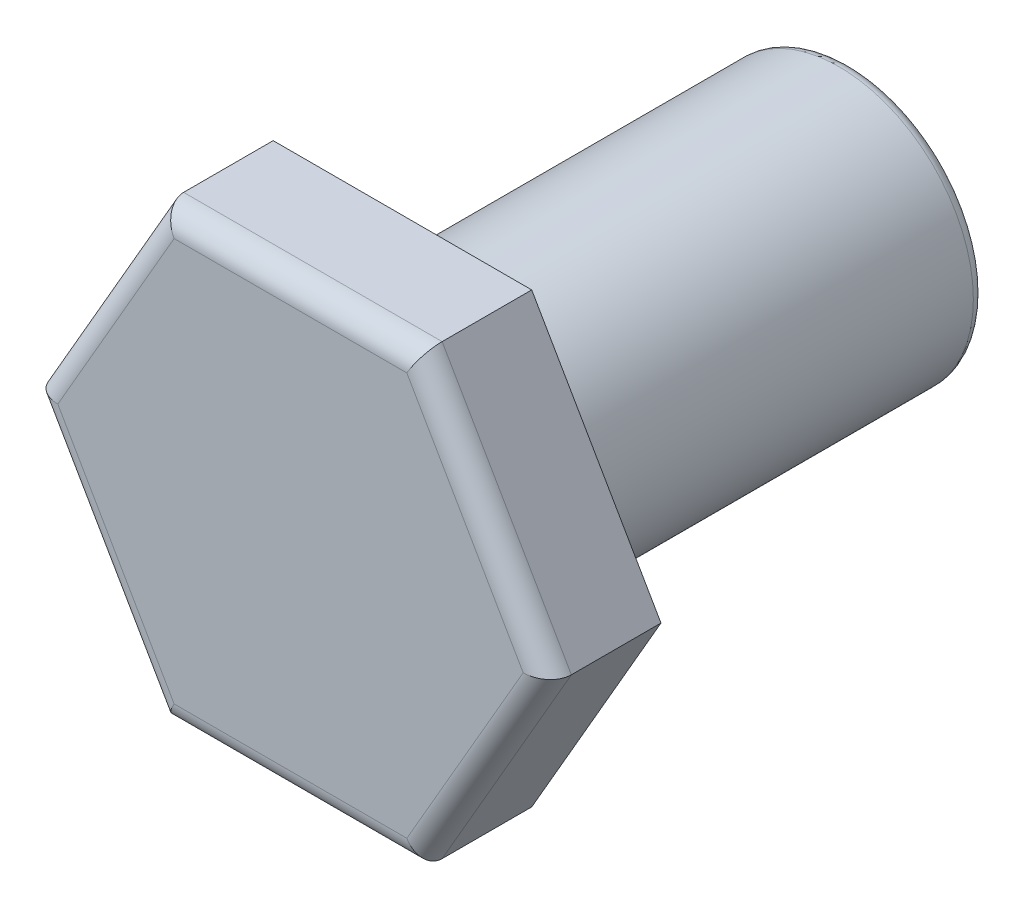
ISO-10303-21;
HEADER;
FILE_DESCRIPTION(('STEP AP214'),'2;1');
FILE_NAME('part.step','',(''),(''),'','','');
FILE_SCHEMA(('AUTOMOTIVE_DESIGN { 1 0 10303 214 1 1 1 1 }'));
ENDSEC;
DATA;
#1=APPLICATION_CONTEXT('core data for automotive mechanical design processes');
#2=APPLICATION_PROTOCOL_DEFINITION('international standard','automotive_design',2000,#1);
#3=PRODUCT_CONTEXT('',#1,'mechanical');
#4=PRODUCT('Part','Part','',(#3));
#5=PRODUCT_RELATED_PRODUCT_CATEGORY('part','',(#4));
#6=PRODUCT_DEFINITION_FORMATION('','',#4);
#7=PRODUCT_DEFINITION_CONTEXT('part definition',#1,'design');
#8=PRODUCT_DEFINITION('design','',#6,#7);
#9=PRODUCT_DEFINITION_SHAPE('','',#8);
#10=(LENGTH_UNIT() NAMED_UNIT(*) SI_UNIT(.MILLI.,.METRE.));
#11=(NAMED_UNIT(*) PLANE_ANGLE_UNIT() SI_UNIT($,.RADIAN.));
#12=(NAMED_UNIT(*) SI_UNIT($,.STERADIAN.) SOLID_ANGLE_UNIT());
#13=UNCERTAINTY_MEASURE_WITH_UNIT(LENGTH_MEASURE(1.E-05),#10,'distance_accuracy_value','');
#14=(GEOMETRIC_REPRESENTATION_CONTEXT(3) GLOBAL_UNCERTAINTY_ASSIGNED_CONTEXT((#13)) GLOBAL_UNIT_ASSIGNED_CONTEXT((#10,
#11,#12)) REPRESENTATION_CONTEXT('',''));
#15=CARTESIAN_POINT('',(0.,0.,0.));
#16=DIRECTION('',(0.,0.,1.));
#17=DIRECTION('',(1.,0.,0.));
#18=AXIS2_PLACEMENT_3D('',#15,#16,#17);
#19=CARTESIAN_POINT('',(0.,0.,25.));
#20=DIRECTION('',(0.,0.,-1.));
#21=DIRECTION('',(-1.,0.,0.));
#22=AXIS2_PLACEMENT_3D('',#19,#20,#21);
#23=CYLINDRICAL_SURFACE('',#22,6.);
#24=CARTESIAN_POINT('',(0.,0.,0.5));
#25=DIRECTION('',(0.,0.,1.));
#26=DIRECTION('',(1.,0.,0.));
#27=AXIS2_PLACEMENT_3D('',#24,#25,#26);
#28=CIRCLE('',#27,6.);
#29=CARTESIAN_POINT('',(6.,0.,0.5));
#30=VERTEX_POINT('',#29);
#31=EDGE_CURVE('E42',#30,#30,#28,.T.);
#32=ORIENTED_EDGE('',*,*,#31,.T.);
#33=EDGE_LOOP('',(#32));
#34=FACE_BOUND('',#33,.T.);
#35=CARTESIAN_POINT('',(0.,0.,20.));
#36=DIRECTION('',(0.,0.,1.));
#37=DIRECTION('',(1.,0.,0.));
#38=AXIS2_PLACEMENT_3D('',#35,#36,#37);
#39=CIRCLE('',#38,6.);
#40=CARTESIAN_POINT('',(6.,0.,20.));
#41=VERTEX_POINT('',#40);
#42=EDGE_CURVE('E149',#41,#41,#39,.T.);
#43=ORIENTED_EDGE('',*,*,#42,.F.);
#44=EDGE_LOOP('',(#43));
#45=FACE_BOUND('',#44,.T.);
#46=ADVANCED_FACE('F34',(#34,#45),#23,.T.);
#47=CARTESIAN_POINT('',(0.,0.,0.));
#48=DIRECTION('',(0.,0.,1.));
#49=DIRECTION('',(1.,0.,0.));
#50=AXIS2_PLACEMENT_3D('',#47,#48,#49);
#51=PLANE('',#50);
#52=CARTESIAN_POINT('',(0.,0.,0.));
#53=DIRECTION('',(0.,0.,1.));
#54=DIRECTION('',(1.,0.,0.));
#55=AXIS2_PLACEMENT_3D('',#52,#53,#54);
#56=CIRCLE('',#55,5.5);
#57=CARTESIAN_POINT('',(5.5,0.,0.));
#58=VERTEX_POINT('',#57);
#59=EDGE_CURVE('E11',#58,#58,#56,.F.);
#60=ORIENTED_EDGE('',*,*,#59,.T.);
#61=EDGE_LOOP('',(#60));
#62=FACE_BOUND('',#61,.T.);
#63=ADVANCED_FACE('F208',(#62),#51,.F.);
#64=CARTESIAN_POINT('',(0.,0.,20.));
#65=DIRECTION('',(0.,0.,1.));
#66=DIRECTION('',(1.,0.,0.));
#67=AXIS2_PLACEMENT_3D('',#64,#65,#66);
#68=PLANE('',#67);
#69=DIRECTION('',(1.,0.,0.));
#70=VECTOR('',#69,1.);
#71=CARTESIAN_POINT('',(-5.77350269189626,-10.,20.));
#72=LINE('',#71,#70);
#73=CARTESIAN_POINT('',(-5.77350269189626,-10.,20.));
#74=VERTEX_POINT('',#73);
#75=CARTESIAN_POINT('',(5.77350269189626,-10.,20.));
#76=VERTEX_POINT('',#75);
#77=EDGE_CURVE('E125',#74,#76,#72,.T.);
#78=ORIENTED_EDGE('',*,*,#77,.F.);
#79=DIRECTION('',(0.5,-0.866025403784439,0.));
#80=VECTOR('',#79,1.);
#81=CARTESIAN_POINT('',(-11.5470053837925,0.,20.));
#82=LINE('',#81,#80);
#83=CARTESIAN_POINT('',(-11.5470053837925,0.,20.));
#84=VERTEX_POINT('',#83);
#85=EDGE_CURVE('E117',#84,#74,#82,.T.);
#86=ORIENTED_EDGE('',*,*,#85,.F.);
#87=DIRECTION('',(-0.5,-0.866025403784439,0.));
#88=VECTOR('',#87,1.);
#89=CARTESIAN_POINT('',(-5.77350269189626,10.,20.));
#90=LINE('',#89,#88);
#91=CARTESIAN_POINT('',(-5.77350269189626,10.,20.));
#92=VERTEX_POINT('',#91);
#93=EDGE_CURVE('E144',#92,#84,#90,.T.);
#94=ORIENTED_EDGE('',*,*,#93,.F.);
#95=DIRECTION('',(-1.,0.,0.));
#96=VECTOR('',#95,1.);
#97=CARTESIAN_POINT('',(5.77350269189626,10.,20.));
#98=LINE('',#97,#96);
#99=CARTESIAN_POINT('',(5.77350269189626,10.,20.));
#100=VERTEX_POINT('',#99);
#101=EDGE_CURVE('E141',#100,#92,#98,.T.);
#102=ORIENTED_EDGE('',*,*,#101,.F.);
#103=DIRECTION('',(-0.5,0.866025403784439,0.));
#104=VECTOR('',#103,1.);
#105=CARTESIAN_POINT('',(11.5470053837925,0.,20.));
#106=LINE('',#105,#104);
#107=CARTESIAN_POINT('',(11.5470053837925,0.,20.));
#108=VERTEX_POINT('',#107);
#109=EDGE_CURVE('E129',#108,#100,#106,.T.);
#110=ORIENTED_EDGE('',*,*,#109,.F.);
#111=DIRECTION('',(0.5,0.866025403784439,0.));
#112=VECTOR('',#111,1.);
#113=CARTESIAN_POINT('',(5.77350269189626,-10.,20.));
#114=LINE('',#113,#112);
#115=EDGE_CURVE('E111',#76,#108,#114,.T.);
#116=ORIENTED_EDGE('',*,*,#115,.F.);
#117=EDGE_LOOP('',(#78,#86,#94,#102,#110,#116));
#118=FACE_BOUND('',#117,.T.);
#119=ORIENTED_EDGE('',*,*,#42,.T.);
#120=EDGE_LOOP('',(#119));
#121=FACE_BOUND('',#120,.T.);
#122=ADVANCED_FACE('F122',(#118,#121),#68,.F.);
#123=CARTESIAN_POINT('',(-5.77350269189626,-10.,20.));
#124=DIRECTION('',(0.,-1.,0.));
#125=DIRECTION('',(1.,0.,0.));
#126=AXIS2_PLACEMENT_3D('',#123,#124,#125);
#127=PLANE('',#126);
#128=DIRECTION('',(0.,0.,1.));
#129=VECTOR('',#128,1.);
#130=CARTESIAN_POINT('',(5.77350269189626,-10.,20.));
#131=LINE('',#130,#129);
#132=CARTESIAN_POINT('',(5.77350269189626,-10.,24.));
#133=VERTEX_POINT('',#132);
#134=EDGE_CURVE('E107',#76,#133,#131,.T.);
#135=ORIENTED_EDGE('',*,*,#134,.T.);
#136=DIRECTION('',(1.,0.,0.));
#137=VECTOR('',#136,1.);
#138=CARTESIAN_POINT('',(-5.77350269189626,-10.,24.));
#139=LINE('',#138,#137);
#140=CARTESIAN_POINT('',(-5.77350269189626,-10.,24.));
#141=VERTEX_POINT('',#140);
#142=EDGE_CURVE('E173',#133,#141,#139,.F.);
#143=ORIENTED_EDGE('',*,*,#142,.T.);
#144=DIRECTION('',(0.,0.,1.));
#145=VECTOR('',#144,1.);
#146=CARTESIAN_POINT('',(-5.77350269189626,-10.,20.));
#147=LINE('',#146,#145);
#148=EDGE_CURVE('E133',#74,#141,#147,.T.);
#149=ORIENTED_EDGE('',*,*,#148,.F.);
#150=ORIENTED_EDGE('',*,*,#77,.T.);
#151=EDGE_LOOP('',(#135,#143,#149,#150));
#152=FACE_BOUND('',#151,.T.);
#153=ADVANCED_FACE('F131',(#152),#127,.T.);
#154=CARTESIAN_POINT('',(-11.5470053837925,0.,20.));
#155=DIRECTION('',(-0.866025403784439,-0.5,0.));
#156=DIRECTION('',(0.5,-0.866025403784439,0.));
#157=AXIS2_PLACEMENT_3D('',#154,#155,#156);
#158=PLANE('',#157);
#159=ORIENTED_EDGE('',*,*,#148,.T.);
#160=DIRECTION('',(0.5,-0.866025403784439,0.));
#161=VECTOR('',#160,1.);
#162=CARTESIAN_POINT('',(-11.5470053837925,0.,24.));
#163=LINE('',#162,#161);
#164=CARTESIAN_POINT('',(-11.5470053837925,0.,24.));
#165=VERTEX_POINT('',#164);
#166=EDGE_CURVE('E175',#141,#165,#163,.F.);
#167=ORIENTED_EDGE('',*,*,#166,.T.);
#168=DIRECTION('',(0.,0.,1.));
#169=VECTOR('',#168,1.);
#170=CARTESIAN_POINT('',(-11.5470053837925,0.,20.));
#171=LINE('',#170,#169);
#172=EDGE_CURVE('E150',#84,#165,#171,.T.);
#173=ORIENTED_EDGE('',*,*,#172,.F.);
#174=ORIENTED_EDGE('',*,*,#85,.T.);
#175=EDGE_LOOP('',(#159,#167,#173,#174));
#176=FACE_BOUND('',#175,.T.);
#177=ADVANCED_FACE('F256',(#176),#158,.T.);
#178=CARTESIAN_POINT('',(-5.77350269189626,10.,20.));
#179=DIRECTION('',(-0.866025403784439,0.5,0.));
#180=DIRECTION('',(-0.5,-0.866025403784439,0.));
#181=AXIS2_PLACEMENT_3D('',#178,#179,#180);
#182=PLANE('',#181);
#183=ORIENTED_EDGE('',*,*,#172,.T.);
#184=DIRECTION('',(-0.5,-0.866025403784439,0.));
#185=VECTOR('',#184,1.);
#186=CARTESIAN_POINT('',(-5.77350269189626,10.,24.));
#187=LINE('',#186,#185);
#188=CARTESIAN_POINT('',(-5.77350269189626,10.,24.));
#189=VERTEX_POINT('',#188);
#190=EDGE_CURVE('E57',#165,#189,#187,.F.);
#191=ORIENTED_EDGE('',*,*,#190,.T.);
#192=DIRECTION('',(0.,0.,1.));
#193=VECTOR('',#192,1.);
#194=CARTESIAN_POINT('',(-5.77350269189626,10.,20.));
#195=LINE('',#194,#193);
#196=EDGE_CURVE('E152',#92,#189,#195,.T.);
#197=ORIENTED_EDGE('',*,*,#196,.F.);
#198=ORIENTED_EDGE('',*,*,#93,.T.);
#199=EDGE_LOOP('',(#183,#191,#197,#198));
#200=FACE_BOUND('',#199,.T.);
#201=ADVANCED_FACE('F260',(#200),#182,.T.);
#202=CARTESIAN_POINT('',(5.77350269189626,10.,20.));
#203=DIRECTION('',(0.,1.,0.));
#204=DIRECTION('',(-1.,0.,0.));
#205=AXIS2_PLACEMENT_3D('',#202,#203,#204);
#206=PLANE('',#205);
#207=ORIENTED_EDGE('',*,*,#196,.T.);
#208=DIRECTION('',(-1.,0.,0.));
#209=VECTOR('',#208,1.);
#210=CARTESIAN_POINT('',(5.77350269189626,10.,24.));
#211=LINE('',#210,#209);
#212=CARTESIAN_POINT('',(5.77350269189626,10.,24.));
#213=VERTEX_POINT('',#212);
#214=EDGE_CURVE('E49',#189,#213,#211,.F.);
#215=ORIENTED_EDGE('',*,*,#214,.T.);
#216=DIRECTION('',(0.,0.,1.));
#217=VECTOR('',#216,1.);
#218=CARTESIAN_POINT('',(5.77350269189626,10.,20.));
#219=LINE('',#218,#217);
#220=EDGE_CURVE('E154',#100,#213,#219,.T.);
#221=ORIENTED_EDGE('',*,*,#220,.F.);
#222=ORIENTED_EDGE('',*,*,#101,.T.);
#223=EDGE_LOOP('',(#207,#215,#221,#222));
#224=FACE_BOUND('',#223,.T.);
#225=ADVANCED_FACE('F259',(#224),#206,.T.);
#226=CARTESIAN_POINT('',(11.5470053837925,0.,20.));
#227=DIRECTION('',(0.866025403784439,0.5,0.));
#228=DIRECTION('',(-0.5,0.866025403784439,0.));
#229=AXIS2_PLACEMENT_3D('',#226,#227,#228);
#230=PLANE('',#229);
#231=ORIENTED_EDGE('',*,*,#220,.T.);
#232=DIRECTION('',(-0.5,0.866025403784439,0.));
#233=VECTOR('',#232,1.);
#234=CARTESIAN_POINT('',(11.5470053837925,0.,24.));
#235=LINE('',#234,#233);
#236=CARTESIAN_POINT('',(11.5470053837925,0.,24.));
#237=VERTEX_POINT('',#236);
#238=EDGE_CURVE('E179',#213,#237,#235,.F.);
#239=ORIENTED_EDGE('',*,*,#238,.T.);
#240=DIRECTION('',(0.,0.,1.));
#241=VECTOR('',#240,1.);
#242=CARTESIAN_POINT('',(11.5470053837925,0.,20.));
#243=LINE('',#242,#241);
#244=EDGE_CURVE('E116',#108,#237,#243,.T.);
#245=ORIENTED_EDGE('',*,*,#244,.F.);
#246=ORIENTED_EDGE('',*,*,#109,.T.);
#247=EDGE_LOOP('',(#231,#239,#245,#246));
#248=FACE_BOUND('',#247,.T.);
#249=ADVANCED_FACE('F248',(#248),#230,.T.);
#250=CARTESIAN_POINT('',(5.77350269189626,-10.,20.));
#251=DIRECTION('',(0.866025403784439,-0.5,0.));
#252=DIRECTION('',(0.5,0.866025403784439,0.));
#253=AXIS2_PLACEMENT_3D('',#250,#251,#252);
#254=PLANE('',#253);
#255=ORIENTED_EDGE('',*,*,#244,.T.);
#256=DIRECTION('',(0.5,0.866025403784439,0.));
#257=VECTOR('',#256,1.);
#258=CARTESIAN_POINT('',(5.77350269189626,-10.,24.));
#259=LINE('',#258,#257);
#260=EDGE_CURVE('E113',#237,#133,#259,.F.);
#261=ORIENTED_EDGE('',*,*,#260,.T.);
#262=ORIENTED_EDGE('',*,*,#134,.F.);
#263=ORIENTED_EDGE('',*,*,#115,.T.);
#264=EDGE_LOOP('',(#255,#261,#262,#263));
#265=FACE_BOUND('',#264,.T.);
#266=ADVANCED_FACE('F110',(#265),#254,.T.);
#267=CARTESIAN_POINT('',(0.,0.,25.));
#268=DIRECTION('',(0.,0.,1.));
#269=DIRECTION('',(1.,0.,0.));
#270=AXIS2_PLACEMENT_3D('',#267,#268,#269);
#271=PLANE('',#270);
#272=DIRECTION('',(1.,0.,0.));
#273=VECTOR('',#272,1.);
#274=CARTESIAN_POINT('',(0.,-9.,25.));
#275=LINE('',#274,#273);
#276=CARTESIAN_POINT('',(-5.19615242270663,-9.,25.));
#277=VERTEX_POINT('',#276);
#278=CARTESIAN_POINT('',(5.19615242270664,-9.,25.));
#279=VERTEX_POINT('',#278);
#280=EDGE_CURVE('E167',#277,#279,#275,.T.);
#281=ORIENTED_EDGE('',*,*,#280,.T.);
#282=DIRECTION('',(0.5,0.866025403784439,0.));
#283=VECTOR('',#282,1.);
#284=CARTESIAN_POINT('',(7.79422863405995,-4.5,25.));
#285=LINE('',#284,#283);
#286=CARTESIAN_POINT('',(10.3923048454133,0.,25.));
#287=VERTEX_POINT('',#286);
#288=EDGE_CURVE('E169',#279,#287,#285,.T.);
#289=ORIENTED_EDGE('',*,*,#288,.T.);
#290=DIRECTION('',(-0.5,0.866025403784439,0.));
#291=VECTOR('',#290,1.);
#292=CARTESIAN_POINT('',(7.79422863405995,4.5,25.));
#293=LINE('',#292,#291);
#294=CARTESIAN_POINT('',(5.19615242270663,9.,25.));
#295=VERTEX_POINT('',#294);
#296=EDGE_CURVE('E159',#287,#295,#293,.T.);
#297=ORIENTED_EDGE('',*,*,#296,.T.);
#298=DIRECTION('',(-1.,0.,0.));
#299=VECTOR('',#298,1.);
#300=CARTESIAN_POINT('',(0.,9.,25.));
#301=LINE('',#300,#299);
#302=CARTESIAN_POINT('',(-5.19615242270663,9.,25.));
#303=VERTEX_POINT('',#302);
#304=EDGE_CURVE('E161',#295,#303,#301,.T.);
#305=ORIENTED_EDGE('',*,*,#304,.T.);
#306=DIRECTION('',(-0.5,-0.866025403784439,0.));
#307=VECTOR('',#306,1.);
#308=CARTESIAN_POINT('',(-7.79422863405995,4.5,25.));
#309=LINE('',#308,#307);
#310=CARTESIAN_POINT('',(-10.3923048454133,0.,25.));
#311=VERTEX_POINT('',#310);
#312=EDGE_CURVE('E163',#303,#311,#309,.T.);
#313=ORIENTED_EDGE('',*,*,#312,.T.);
#314=DIRECTION('',(0.5,-0.866025403784439,0.));
#315=VECTOR('',#314,1.);
#316=CARTESIAN_POINT('',(-7.79422863405995,-4.5,25.));
#317=LINE('',#316,#315);
#318=EDGE_CURVE('E165',#311,#277,#317,.T.);
#319=ORIENTED_EDGE('',*,*,#318,.T.);
#320=EDGE_LOOP('',(#281,#289,#297,#305,#313,#319));
#321=FACE_BOUND('',#320,.T.);
#322=ADVANCED_FACE('F233',(#321),#271,.T.);
#323=CARTESIAN_POINT('',(-7.79422863405995,4.5,24.));
#324=DIRECTION('',(-0.5,-0.866025403784439,0.));
#325=DIRECTION('',(0.866025403784439,-0.5,0.));
#326=AXIS2_PLACEMENT_3D('',#323,#324,#325);
#327=CYLINDRICAL_SURFACE('',#326,1.);
#328=CARTESIAN_POINT('',(-5.19615242270663,9.,24.));
#329=DIRECTION('',(-0.866025403784439,-0.5,0.));
#330=DIRECTION('',(-0.5,0.866025403784439,0.));
#331=AXIS2_PLACEMENT_3D('',#328,#329,#330);
#332=ELLIPSE('',#331,1.15470053837925,1.);
#333=EDGE_CURVE('E137',#189,#303,#332,.F.);
#334=ORIENTED_EDGE('',*,*,#333,.F.);
#335=ORIENTED_EDGE('',*,*,#190,.F.);
#336=CARTESIAN_POINT('',(-10.3923048454133,0.,24.));
#337=DIRECTION('',(0.,-1.,0.));
#338=DIRECTION('',(-1.,0.,0.));
#339=AXIS2_PLACEMENT_3D('',#336,#337,#338);
#340=ELLIPSE('',#339,1.15470053837925,1.);
#341=EDGE_CURVE('E134',#311,#165,#340,.T.);
#342=ORIENTED_EDGE('',*,*,#341,.F.);
#343=ORIENTED_EDGE('',*,*,#312,.F.);
#344=EDGE_LOOP('',(#334,#335,#342,#343));
#345=FACE_BOUND('',#344,.T.);
#346=ADVANCED_FACE('F230',(#345),#327,.T.);
#347=CARTESIAN_POINT('',(-7.79422863405995,-4.5,24.));
#348=DIRECTION('',(0.5,-0.866025403784439,0.));
#349=DIRECTION('',(0.866025403784439,0.5,0.));
#350=AXIS2_PLACEMENT_3D('',#347,#348,#349);
#351=CYLINDRICAL_SURFACE('',#350,1.);
#352=ORIENTED_EDGE('',*,*,#341,.T.);
#353=ORIENTED_EDGE('',*,*,#166,.F.);
#354=CARTESIAN_POINT('',(-5.19615242270663,-9.,24.));
#355=DIRECTION('',(0.866025403784439,-0.5,0.));
#356=DIRECTION('',(-0.5,-0.866025403784439,0.));
#357=AXIS2_PLACEMENT_3D('',#354,#355,#356);
#358=ELLIPSE('',#357,1.15470053837925,1.);
#359=EDGE_CURVE('E188',#277,#141,#358,.T.);
#360=ORIENTED_EDGE('',*,*,#359,.F.);
#361=ORIENTED_EDGE('',*,*,#318,.F.);
#362=EDGE_LOOP('',(#352,#353,#360,#361));
#363=FACE_BOUND('',#362,.T.);
#364=ADVANCED_FACE('F227',(#363),#351,.T.);
#365=CARTESIAN_POINT('',(0.,9.,24.));
#366=DIRECTION('',(-1.,0.,0.));
#367=DIRECTION('',(0.,-1.,0.));
#368=AXIS2_PLACEMENT_3D('',#365,#366,#367);
#369=CYLINDRICAL_SURFACE('',#368,1.);
#370=ORIENTED_EDGE('',*,*,#333,.T.);
#371=ORIENTED_EDGE('',*,*,#304,.F.);
#372=CARTESIAN_POINT('',(5.19615242270663,9.,24.));
#373=DIRECTION('',(-0.866025403784439,0.5,0.));
#374=DIRECTION('',(0.5,0.866025403784439,0.));
#375=AXIS2_PLACEMENT_3D('',#372,#373,#374);
#376=ELLIPSE('',#375,1.15470053837925,1.);
#377=EDGE_CURVE('E185',#213,#295,#376,.F.);
#378=ORIENTED_EDGE('',*,*,#377,.F.);
#379=ORIENTED_EDGE('',*,*,#214,.F.);
#380=EDGE_LOOP('',(#370,#371,#378,#379));
#381=FACE_BOUND('',#380,.T.);
#382=ADVANCED_FACE('F223',(#381),#369,.T.);
#383=CARTESIAN_POINT('',(0.,-9.,24.));
#384=DIRECTION('',(1.,0.,0.));
#385=DIRECTION('',(0.,1.,0.));
#386=AXIS2_PLACEMENT_3D('',#383,#384,#385);
#387=CYLINDRICAL_SURFACE('',#386,1.);
#388=ORIENTED_EDGE('',*,*,#359,.T.);
#389=ORIENTED_EDGE('',*,*,#142,.F.);
#390=CARTESIAN_POINT('',(5.19615242270663,-9.,24.));
#391=DIRECTION('',(0.866025403784438,0.5,0.));
#392=DIRECTION('',(0.5,-0.866025403784439,0.));
#393=AXIS2_PLACEMENT_3D('',#390,#391,#392);
#394=ELLIPSE('',#393,1.15470053837925,1.);
#395=EDGE_CURVE('E183',#279,#133,#394,.T.);
#396=ORIENTED_EDGE('',*,*,#395,.F.);
#397=ORIENTED_EDGE('',*,*,#280,.F.);
#398=EDGE_LOOP('',(#388,#389,#396,#397));
#399=FACE_BOUND('',#398,.T.);
#400=ADVANCED_FACE('F219',(#399),#387,.T.);
#401=CARTESIAN_POINT('',(7.79422863405995,4.5,24.));
#402=DIRECTION('',(-0.5,0.866025403784439,0.));
#403=DIRECTION('',(-0.866025403784439,-0.5,0.));
#404=AXIS2_PLACEMENT_3D('',#401,#402,#403);
#405=CYLINDRICAL_SURFACE('',#404,1.);
#406=ORIENTED_EDGE('',*,*,#377,.T.);
#407=ORIENTED_EDGE('',*,*,#296,.F.);
#408=CARTESIAN_POINT('',(10.3923048454133,0.,24.));
#409=DIRECTION('',(0.,1.,0.));
#410=DIRECTION('',(-1.,0.,0.));
#411=AXIS2_PLACEMENT_3D('',#408,#409,#410);
#412=ELLIPSE('',#411,1.15470053837925,1.);
#413=EDGE_CURVE('E181',#237,#287,#412,.F.);
#414=ORIENTED_EDGE('',*,*,#413,.F.);
#415=ORIENTED_EDGE('',*,*,#238,.F.);
#416=EDGE_LOOP('',(#406,#407,#414,#415));
#417=FACE_BOUND('',#416,.T.);
#418=ADVANCED_FACE('F203',(#417),#405,.T.);
#419=CARTESIAN_POINT('',(7.79422863405995,-4.5,24.));
#420=DIRECTION('',(0.5,0.866025403784439,0.));
#421=DIRECTION('',(-0.866025403784439,0.5,0.));
#422=AXIS2_PLACEMENT_3D('',#419,#420,#421);
#423=CYLINDRICAL_SURFACE('',#422,1.);
#424=ORIENTED_EDGE('',*,*,#395,.T.);
#425=ORIENTED_EDGE('',*,*,#260,.F.);
#426=ORIENTED_EDGE('',*,*,#413,.T.);
#427=ORIENTED_EDGE('',*,*,#288,.F.);
#428=EDGE_LOOP('',(#424,#425,#426,#427));
#429=FACE_BOUND('',#428,.T.);
#430=ADVANCED_FACE('F198',(#429),#423,.T.);
#431=CARTESIAN_POINT('',(0.,0.,0.5));
#432=DIRECTION('',(0.,0.,1.));
#433=DIRECTION('',(1.,0.,0.));
#434=AXIS2_PLACEMENT_3D('',#431,#432,#433);
#435=TOROIDAL_SURFACE('',#434,5.5,0.5);
#436=ORIENTED_EDGE('',*,*,#59,.F.);
#437=EDGE_LOOP('',(#436));
#438=FACE_BOUND('',#437,.T.);
#439=ORIENTED_EDGE('',*,*,#31,.F.);
#440=EDGE_LOOP('',(#439));
#441=FACE_BOUND('',#440,.T.);
#442=ADVANCED_FACE('F36',(#438,#441),#435,.T.);
#443=CLOSED_SHELL('',(#46,#63,#122,#153,#177,#201,#225,#249,#266,#322,#346,#364,#382,#400,#418,
#430,#442));
#444=MANIFOLD_SOLID_BREP('B2',#443);
#445=ADVANCED_BREP_SHAPE_REPRESENTATION('',(#18,#444),#14);
#446=SHAPE_DEFINITION_REPRESENTATION(#9,#445);
ENDSEC;
END-ISO-10303-21;
